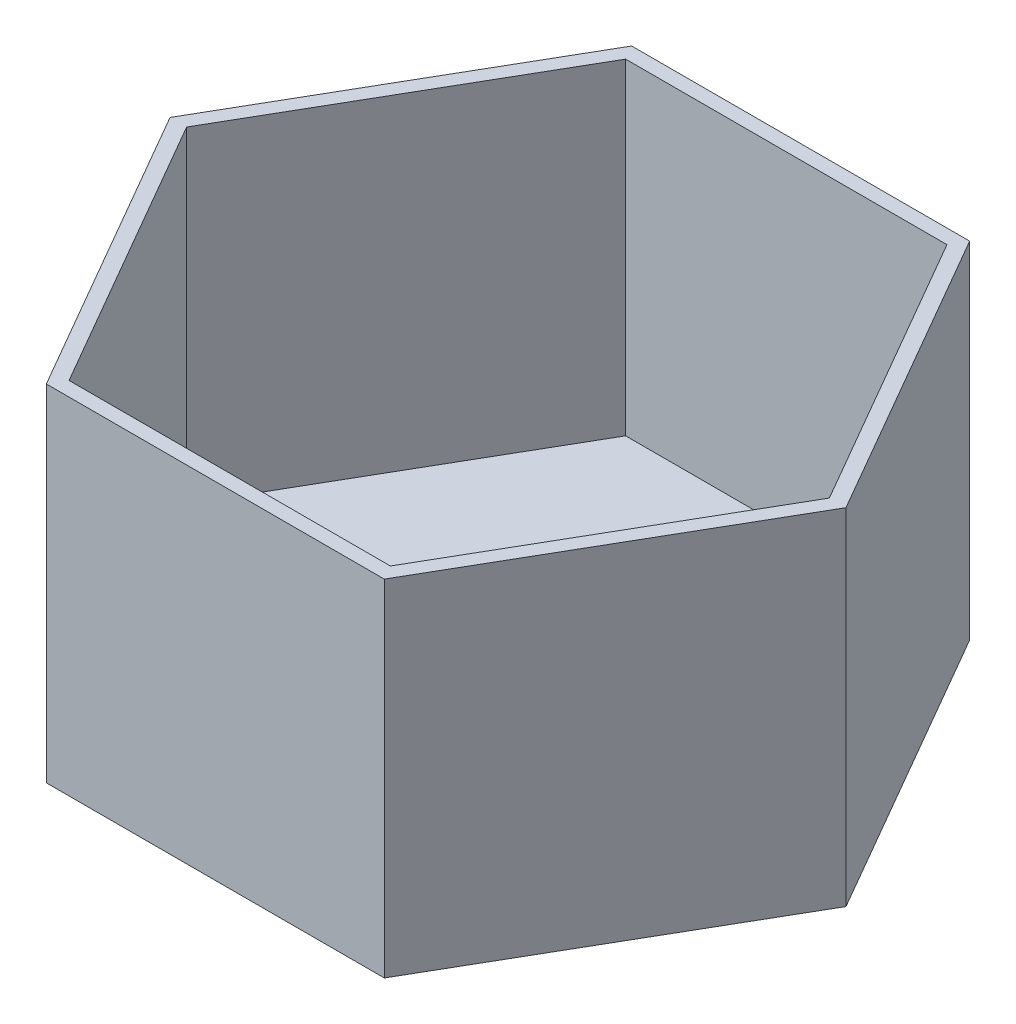
ISO-10303-21;
HEADER;
FILE_DESCRIPTION(('STEP AP214'),'2;1');
FILE_NAME('part.step','',(''),(''),'','','');
FILE_SCHEMA(('AUTOMOTIVE_DESIGN { 1 0 10303 214 1 1 1 1 }'));
ENDSEC;
DATA;
#1=APPLICATION_CONTEXT('core data for automotive mechanical design processes');
#2=APPLICATION_PROTOCOL_DEFINITION('international standard','automotive_design',2000,#1);
#3=PRODUCT_CONTEXT('',#1,'mechanical');
#4=PRODUCT('Part','Part','',(#3));
#5=PRODUCT_RELATED_PRODUCT_CATEGORY('part','',(#4));
#6=PRODUCT_DEFINITION_FORMATION('','',#4);
#7=PRODUCT_DEFINITION_CONTEXT('part definition',#1,'design');
#8=PRODUCT_DEFINITION('design','',#6,#7);
#9=PRODUCT_DEFINITION_SHAPE('','',#8);
#10=(LENGTH_UNIT() NAMED_UNIT(*) SI_UNIT(.MILLI.,.METRE.));
#11=(NAMED_UNIT(*) PLANE_ANGLE_UNIT() SI_UNIT($,.RADIAN.));
#12=(NAMED_UNIT(*) SI_UNIT($,.STERADIAN.) SOLID_ANGLE_UNIT());
#13=UNCERTAINTY_MEASURE_WITH_UNIT(LENGTH_MEASURE(1.E-05),#10,'distance_accuracy_value','');
#14=(GEOMETRIC_REPRESENTATION_CONTEXT(3) GLOBAL_UNCERTAINTY_ASSIGNED_CONTEXT((#13)) GLOBAL_UNIT_ASSIGNED_CONTEXT((#10,
#11,#12)) REPRESENTATION_CONTEXT('',''));
#15=CARTESIAN_POINT('',(0.,0.,0.));
#16=DIRECTION('',(0.,0.,1.));
#17=DIRECTION('',(1.,0.,0.));
#18=AXIS2_PLACEMENT_3D('',#15,#16,#17);
#19=CARTESIAN_POINT('',(35.2183664205679,72.,60.9999999999996));
#20=DIRECTION('',(-0.866025403784441,0.,-0.499999999999995));
#21=DIRECTION('',(-0.499999999999995,0.,0.866025403784442));
#22=AXIS2_PLACEMENT_3D('',#19,#20,#21);
#23=PLANE('',#22);
#24=DIRECTION('',(0.499999999999995,0.,-0.866025403784442));
#25=VECTOR('',#24,1.);
#26=CARTESIAN_POINT('',(35.2183664205679,0.,60.9999999999996));
#27=LINE('',#26,#25);
#28=CARTESIAN_POINT('',(35.2183664205679,0.,60.9999999999996));
#29=VERTEX_POINT('',#28);
#30=CARTESIAN_POINT('',(70.4367328411344,0.,0.));
#31=VERTEX_POINT('',#30);
#32=EDGE_CURVE('E133',#29,#31,#27,.T.);
#33=ORIENTED_EDGE('',*,*,#32,.T.);
#34=DIRECTION('',(0.,-1.,0.));
#35=VECTOR('',#34,1.);
#36=CARTESIAN_POINT('',(70.4367328411344,72.,0.));
#37=LINE('',#36,#35);
#38=CARTESIAN_POINT('',(70.4367328411344,72.,0.));
#39=VERTEX_POINT('',#38);
#40=EDGE_CURVE('E11',#39,#31,#37,.T.);
#41=ORIENTED_EDGE('',*,*,#40,.F.);
#42=DIRECTION('',(0.499999999999995,0.,-0.866025403784442));
#43=VECTOR('',#42,1.);
#44=CARTESIAN_POINT('',(35.2183664205679,72.,60.9999999999996));
#45=LINE('',#44,#43);
#46=CARTESIAN_POINT('',(35.2183664205679,72.,60.9999999999996));
#47=VERTEX_POINT('',#46);
#48=EDGE_CURVE('E145',#47,#39,#45,.T.);
#49=ORIENTED_EDGE('',*,*,#48,.F.);
#50=DIRECTION('',(0.,-1.,0.));
#51=VECTOR('',#50,1.);
#52=CARTESIAN_POINT('',(35.2183664205679,72.,60.9999999999996));
#53=LINE('',#52,#51);
#54=EDGE_CURVE('E129',#47,#29,#53,.T.);
#55=ORIENTED_EDGE('',*,*,#54,.T.);
#56=EDGE_LOOP('',(#33,#41,#49,#55));
#57=FACE_BOUND('',#56,.T.);
#58=ADVANCED_FACE('F37',(#57),#23,.F.);
#59=CARTESIAN_POINT('',(70.4367328411344,72.,0.));
#60=DIRECTION('',(-0.866025403784438,0.,0.500000000000001));
#61=DIRECTION('',(0.500000000000001,0.,0.866025403784438));
#62=AXIS2_PLACEMENT_3D('',#59,#60,#61);
#63=PLANE('',#62);
#64=DIRECTION('',(-0.500000000000001,0.,-0.866025403784438));
#65=VECTOR('',#64,1.);
#66=CARTESIAN_POINT('',(70.4367328411344,0.,0.));
#67=LINE('',#66,#65);
#68=CARTESIAN_POINT('',(35.2183664205671,0.,-61.0000000000001));
#69=VERTEX_POINT('',#68);
#70=EDGE_CURVE('E136',#31,#69,#67,.T.);
#71=ORIENTED_EDGE('',*,*,#70,.T.);
#72=DIRECTION('',(0.,-1.,0.));
#73=VECTOR('',#72,1.);
#74=CARTESIAN_POINT('',(35.2183664205671,72.,-61.0000000000001));
#75=LINE('',#74,#73);
#76=CARTESIAN_POINT('',(35.2183664205671,72.,-61.0000000000001));
#77=VERTEX_POINT('',#76);
#78=EDGE_CURVE('E44',#77,#69,#75,.T.);
#79=ORIENTED_EDGE('',*,*,#78,.F.);
#80=DIRECTION('',(-0.500000000000001,0.,-0.866025403784438));
#81=VECTOR('',#80,1.);
#82=CARTESIAN_POINT('',(70.4367328411344,72.,0.));
#83=LINE('',#82,#81);
#84=EDGE_CURVE('E95',#39,#77,#83,.T.);
#85=ORIENTED_EDGE('',*,*,#84,.F.);
#86=ORIENTED_EDGE('',*,*,#40,.T.);
#87=EDGE_LOOP('',(#71,#79,#85,#86));
#88=FACE_BOUND('',#87,.T.);
#89=ADVANCED_FACE('F285',(#88),#63,.F.);
#90=CARTESIAN_POINT('',(35.2183664205671,72.,-61.0000000000001));
#91=DIRECTION('',(0.,0.,1.));
#92=DIRECTION('',(1.,0.,0.));
#93=AXIS2_PLACEMENT_3D('',#90,#91,#92);
#94=PLANE('',#93);
#95=DIRECTION('',(-1.,0.,0.));
#96=VECTOR('',#95,1.);
#97=CARTESIAN_POINT('',(35.2183664205671,0.,-61.0000000000001));
#98=LINE('',#97,#96);
#99=CARTESIAN_POINT('',(-35.2183664205675,0.,-60.9999999999999));
#100=VERTEX_POINT('',#99);
#101=EDGE_CURVE('E139',#69,#100,#98,.T.);
#102=ORIENTED_EDGE('',*,*,#101,.T.);
#103=DIRECTION('',(0.,-1.,0.));
#104=VECTOR('',#103,1.);
#105=CARTESIAN_POINT('',(-35.2183664205675,72.,-60.9999999999999));
#106=LINE('',#105,#104);
#107=CARTESIAN_POINT('',(-35.2183664205675,72.,-60.9999999999999));
#108=VERTEX_POINT('',#107);
#109=EDGE_CURVE('E124',#108,#100,#106,.T.);
#110=ORIENTED_EDGE('',*,*,#109,.F.);
#111=DIRECTION('',(-1.,0.,0.));
#112=VECTOR('',#111,1.);
#113=CARTESIAN_POINT('',(35.2183664205671,72.,-61.0000000000001));
#114=LINE('',#113,#112);
#115=EDGE_CURVE('E112',#77,#108,#114,.T.);
#116=ORIENTED_EDGE('',*,*,#115,.F.);
#117=ORIENTED_EDGE('',*,*,#78,.T.);
#118=EDGE_LOOP('',(#102,#110,#116,#117));
#119=FACE_BOUND('',#118,.T.);
#120=ADVANCED_FACE('F151',(#119),#94,.F.);
#121=CARTESIAN_POINT('',(-35.2183664205675,72.,-60.9999999999999));
#122=DIRECTION('',(0.866025403784441,0.,0.499999999999995));
#123=DIRECTION('',(0.499999999999995,0.,-0.866025403784442));
#124=AXIS2_PLACEMENT_3D('',#121,#122,#123);
#125=PLANE('',#124);
#126=DIRECTION('',(-0.499999999999995,0.,0.866025403784442));
#127=VECTOR('',#126,1.);
#128=CARTESIAN_POINT('',(-35.2183664205675,0.,-60.9999999999999));
#129=LINE('',#128,#127);
#130=CARTESIAN_POINT('',(-70.4367328411344,0.,4.918570765678E-13));
#131=VERTEX_POINT('',#130);
#132=EDGE_CURVE('E121',#100,#131,#129,.T.);
#133=ORIENTED_EDGE('',*,*,#132,.T.);
#134=DIRECTION('',(0.,-1.,0.));
#135=VECTOR('',#134,1.);
#136=CARTESIAN_POINT('',(-70.4367328411344,72.,4.918570765678E-13));
#137=LINE('',#136,#135);
#138=CARTESIAN_POINT('',(-70.4367328411344,72.,4.918570765678E-13));
#139=VERTEX_POINT('',#138);
#140=EDGE_CURVE('E118',#139,#131,#137,.T.);
#141=ORIENTED_EDGE('',*,*,#140,.F.);
#142=DIRECTION('',(-0.499999999999995,0.,0.866025403784442));
#143=VECTOR('',#142,1.);
#144=CARTESIAN_POINT('',(-35.2183664205675,72.,-60.9999999999999));
#145=LINE('',#144,#143);
#146=EDGE_CURVE('E105',#108,#139,#145,.T.);
#147=ORIENTED_EDGE('',*,*,#146,.F.);
#148=ORIENTED_EDGE('',*,*,#109,.T.);
#149=EDGE_LOOP('',(#133,#141,#147,#148));
#150=FACE_BOUND('',#149,.T.);
#151=ADVANCED_FACE('F119',(#150),#125,.F.);
#152=CARTESIAN_POINT('',(-70.4367328411344,72.,4.918570765678E-13));
#153=DIRECTION('',(0.866025403784434,0.,-0.500000000000007));
#154=DIRECTION('',(-0.500000000000007,0.,-0.866025403784435));
#155=AXIS2_PLACEMENT_3D('',#152,#153,#154);
#156=PLANE('',#155);
#157=DIRECTION('',(0.500000000000007,0.,0.866025403784434));
#158=VECTOR('',#157,1.);
#159=CARTESIAN_POINT('',(-70.4367328411344,0.,4.918570765678E-13));
#160=LINE('',#159,#158);
#161=CARTESIAN_POINT('',(-35.2183664205666,0.,61.0000000000004));
#162=VERTEX_POINT('',#161);
#163=EDGE_CURVE('E142',#131,#162,#160,.T.);
#164=ORIENTED_EDGE('',*,*,#163,.T.);
#165=DIRECTION('',(0.,-1.,0.));
#166=VECTOR('',#165,1.);
#167=CARTESIAN_POINT('',(-35.2183664205666,72.,61.0000000000004));
#168=LINE('',#167,#166);
#169=CARTESIAN_POINT('',(-35.2183664205666,72.,61.0000000000004));
#170=VERTEX_POINT('',#169);
#171=EDGE_CURVE('E125',#170,#162,#168,.T.);
#172=ORIENTED_EDGE('',*,*,#171,.F.);
#173=DIRECTION('',(0.500000000000007,0.,0.866025403784434));
#174=VECTOR('',#173,1.);
#175=CARTESIAN_POINT('',(-70.4367328411344,72.,4.918570765678E-13));
#176=LINE('',#175,#174);
#177=EDGE_CURVE('E109',#139,#170,#176,.T.);
#178=ORIENTED_EDGE('',*,*,#177,.F.);
#179=ORIENTED_EDGE('',*,*,#140,.T.);
#180=EDGE_LOOP('',(#164,#172,#178,#179));
#181=FACE_BOUND('',#180,.T.);
#182=ADVANCED_FACE('F127',(#181),#156,.F.);
#183=CARTESIAN_POINT('',(-35.2183664205666,72.,61.0000000000004));
#184=DIRECTION('',(0.,0.,-1.));
#185=DIRECTION('',(-1.,0.,0.));
#186=AXIS2_PLACEMENT_3D('',#183,#184,#185);
#187=PLANE('',#186);
#188=DIRECTION('',(1.,0.,0.));
#189=VECTOR('',#188,1.);
#190=CARTESIAN_POINT('',(-35.2183664205666,0.,61.0000000000004));
#191=LINE('',#190,#189);
#192=EDGE_CURVE('E87',#162,#29,#191,.T.);
#193=ORIENTED_EDGE('',*,*,#192,.T.);
#194=ORIENTED_EDGE('',*,*,#54,.F.);
#195=DIRECTION('',(1.,0.,0.));
#196=VECTOR('',#195,1.);
#197=CARTESIAN_POINT('',(-35.2183664205666,72.,61.0000000000004));
#198=LINE('',#197,#196);
#199=EDGE_CURVE('E60',#170,#47,#198,.T.);
#200=ORIENTED_EDGE('',*,*,#199,.F.);
#201=ORIENTED_EDGE('',*,*,#171,.T.);
#202=EDGE_LOOP('',(#193,#194,#200,#201));
#203=FACE_BOUND('',#202,.T.);
#204=ADVANCED_FACE('F155',(#203),#187,.F.);
#205=CARTESIAN_POINT('',(0.,72.,0.));
#206=DIRECTION('',(0.,1.,0.));
#207=DIRECTION('',(0.,0.,1.));
#208=AXIS2_PLACEMENT_3D('',#205,#206,#207);
#209=PLANE('',#208);
#210=DIRECTION('',(0.499999999999999,0.,-0.866025403784439));
#211=VECTOR('',#210,1.);
#212=CARTESIAN_POINT('',(33.4863156129983,72.,58.));
#213=LINE('',#212,#211);
#214=CARTESIAN_POINT('',(33.4863156129983,72.,58.));
#215=VERTEX_POINT('',#214);
#216=CARTESIAN_POINT('',(66.9726312259966,72.,0.));
#217=VERTEX_POINT('',#216);
#218=EDGE_CURVE('E51',#215,#217,#213,.T.);
#219=ORIENTED_EDGE('',*,*,#218,.F.);
#220=DIRECTION('',(1.,0.,0.));
#221=VECTOR('',#220,1.);
#222=CARTESIAN_POINT('',(-33.4863156129983,72.,58.));
#223=LINE('',#222,#221);
#224=CARTESIAN_POINT('',(-33.4863156129983,72.,58.));
#225=VERTEX_POINT('',#224);
#226=EDGE_CURVE('E178',#225,#215,#223,.T.);
#227=ORIENTED_EDGE('',*,*,#226,.F.);
#228=DIRECTION('',(0.5,0.,0.866025403784438));
#229=VECTOR('',#228,1.);
#230=CARTESIAN_POINT('',(-66.9726312259966,72.,0.));
#231=LINE('',#230,#229);
#232=CARTESIAN_POINT('',(-66.9726312259966,72.,0.));
#233=VERTEX_POINT('',#232);
#234=EDGE_CURVE('E182',#233,#225,#231,.T.);
#235=ORIENTED_EDGE('',*,*,#234,.F.);
#236=DIRECTION('',(-0.499999999999999,0.,0.866025403784439));
#237=VECTOR('',#236,1.);
#238=CARTESIAN_POINT('',(-33.4863156129983,72.,-58.));
#239=LINE('',#238,#237);
#240=CARTESIAN_POINT('',(-33.4863156129983,72.,-58.));
#241=VERTEX_POINT('',#240);
#242=EDGE_CURVE('E185',#241,#233,#239,.T.);
#243=ORIENTED_EDGE('',*,*,#242,.F.);
#244=DIRECTION('',(-1.,0.,0.));
#245=VECTOR('',#244,1.);
#246=CARTESIAN_POINT('',(33.4863156129983,72.,-58.0000000000001));
#247=LINE('',#246,#245);
#248=CARTESIAN_POINT('',(33.4863156129983,72.,-58.0000000000001));
#249=VERTEX_POINT('',#248);
#250=EDGE_CURVE('E188',#249,#241,#247,.T.);
#251=ORIENTED_EDGE('',*,*,#250,.F.);
#252=DIRECTION('',(-0.5,0.,-0.866025403784439));
#253=VECTOR('',#252,1.);
#254=CARTESIAN_POINT('',(66.9726312259966,72.,0.));
#255=LINE('',#254,#253);
#256=EDGE_CURVE('E191',#217,#249,#255,.T.);
#257=ORIENTED_EDGE('',*,*,#256,.F.);
#258=EDGE_LOOP('',(#219,#227,#235,#243,#251,#257));
#259=FACE_BOUND('',#258,.T.);
#260=ORIENTED_EDGE('',*,*,#48,.T.);
#261=ORIENTED_EDGE('',*,*,#84,.T.);
#262=ORIENTED_EDGE('',*,*,#115,.T.);
#263=ORIENTED_EDGE('',*,*,#146,.T.);
#264=ORIENTED_EDGE('',*,*,#177,.T.);
#265=ORIENTED_EDGE('',*,*,#199,.T.);
#266=EDGE_LOOP('',(#260,#261,#262,#263,#264,#265));
#267=FACE_BOUND('',#266,.T.);
#268=ADVANCED_FACE('F107',(#259,#267),#209,.T.);
#269=CARTESIAN_POINT('',(0.,0.,0.));
#270=DIRECTION('',(0.,1.,0.));
#271=DIRECTION('',(0.,0.,1.));
#272=AXIS2_PLACEMENT_3D('',#269,#270,#271);
#273=PLANE('',#272);
#274=ORIENTED_EDGE('',*,*,#32,.F.);
#275=ORIENTED_EDGE('',*,*,#192,.F.);
#276=ORIENTED_EDGE('',*,*,#163,.F.);
#277=ORIENTED_EDGE('',*,*,#132,.F.);
#278=ORIENTED_EDGE('',*,*,#101,.F.);
#279=ORIENTED_EDGE('',*,*,#70,.F.);
#280=EDGE_LOOP('',(#274,#275,#276,#277,#278,#279));
#281=FACE_BOUND('',#280,.T.);
#282=ADVANCED_FACE('F154',(#281),#273,.F.);
#283=CARTESIAN_POINT('',(33.4863156129983,3.99999999999999,58.));
#284=DIRECTION('',(0.866025403784439,0.,0.499999999999999));
#285=DIRECTION('',(0.499999999999999,0.,-0.866025403784439));
#286=AXIS2_PLACEMENT_3D('',#283,#284,#285);
#287=PLANE('',#286);
#288=ORIENTED_EDGE('',*,*,#218,.T.);
#289=DIRECTION('',(0.,1.,0.));
#290=VECTOR('',#289,1.);
#291=CARTESIAN_POINT('',(66.9726312259966,3.99999999999999,0.));
#292=LINE('',#291,#290);
#293=CARTESIAN_POINT('',(66.9726312259966,3.99999999999999,0.));
#294=VERTEX_POINT('',#293);
#295=EDGE_CURVE('E162',#294,#217,#292,.T.);
#296=ORIENTED_EDGE('',*,*,#295,.F.);
#297=DIRECTION('',(0.499999999999999,0.,-0.866025403784439));
#298=VECTOR('',#297,1.);
#299=CARTESIAN_POINT('',(33.4863156129983,3.99999999999999,58.));
#300=LINE('',#299,#298);
#301=CARTESIAN_POINT('',(33.4863156129983,3.99999999999999,58.));
#302=VERTEX_POINT('',#301);
#303=EDGE_CURVE('E181',#302,#294,#300,.T.);
#304=ORIENTED_EDGE('',*,*,#303,.F.);
#305=DIRECTION('',(0.,1.,0.));
#306=VECTOR('',#305,1.);
#307=CARTESIAN_POINT('',(33.4863156129983,3.99999999999999,58.));
#308=LINE('',#307,#306);
#309=EDGE_CURVE('E137',#302,#215,#308,.T.);
#310=ORIENTED_EDGE('',*,*,#309,.T.);
#311=EDGE_LOOP('',(#288,#296,#304,#310));
#312=FACE_BOUND('',#311,.T.);
#313=ADVANCED_FACE('F237',(#312),#287,.F.);
#314=CARTESIAN_POINT('',(-33.4863156129983,3.99999999999999,58.));
#315=DIRECTION('',(0.,0.,1.));
#316=DIRECTION('',(1.,0.,0.));
#317=AXIS2_PLACEMENT_3D('',#314,#315,#316);
#318=PLANE('',#317);
#319=ORIENTED_EDGE('',*,*,#226,.T.);
#320=ORIENTED_EDGE('',*,*,#309,.F.);
#321=DIRECTION('',(1.,0.,0.));
#322=VECTOR('',#321,1.);
#323=CARTESIAN_POINT('',(-33.4863156129983,3.99999999999999,58.));
#324=LINE('',#323,#322);
#325=CARTESIAN_POINT('',(-33.4863156129983,3.99999999999999,58.));
#326=VERTEX_POINT('',#325);
#327=EDGE_CURVE('E165',#326,#302,#324,.T.);
#328=ORIENTED_EDGE('',*,*,#327,.F.);
#329=DIRECTION('',(0.,1.,0.));
#330=VECTOR('',#329,1.);
#331=CARTESIAN_POINT('',(-33.4863156129983,3.99999999999999,58.));
#332=LINE('',#331,#330);
#333=EDGE_CURVE('E174',#326,#225,#332,.T.);
#334=ORIENTED_EDGE('',*,*,#333,.T.);
#335=EDGE_LOOP('',(#319,#320,#328,#334));
#336=FACE_BOUND('',#335,.T.);
#337=ADVANCED_FACE('F253',(#336),#318,.F.);
#338=CARTESIAN_POINT('',(-66.9726312259966,3.99999999999999,0.));
#339=DIRECTION('',(-0.866025403784438,0.,0.5));
#340=DIRECTION('',(0.5,0.,0.866025403784438));
#341=AXIS2_PLACEMENT_3D('',#338,#339,#340);
#342=PLANE('',#341);
#343=ORIENTED_EDGE('',*,*,#234,.T.);
#344=ORIENTED_EDGE('',*,*,#333,.F.);
#345=DIRECTION('',(0.5,0.,0.866025403784438));
#346=VECTOR('',#345,1.);
#347=CARTESIAN_POINT('',(-66.9726312259966,3.99999999999999,0.));
#348=LINE('',#347,#346);
#349=CARTESIAN_POINT('',(-66.9726312259966,3.99999999999999,0.));
#350=VERTEX_POINT('',#349);
#351=EDGE_CURVE('E198',#350,#326,#348,.T.);
#352=ORIENTED_EDGE('',*,*,#351,.F.);
#353=DIRECTION('',(0.,1.,0.));
#354=VECTOR('',#353,1.);
#355=CARTESIAN_POINT('',(-66.9726312259966,3.99999999999999,0.));
#356=LINE('',#355,#354);
#357=EDGE_CURVE('E171',#350,#233,#356,.T.);
#358=ORIENTED_EDGE('',*,*,#357,.T.);
#359=EDGE_LOOP('',(#343,#344,#352,#358));
#360=FACE_BOUND('',#359,.T.);
#361=ADVANCED_FACE('F258',(#360),#342,.F.);
#362=CARTESIAN_POINT('',(-33.4863156129983,3.99999999999999,-58.));
#363=DIRECTION('',(-0.866025403784439,0.,-0.5));
#364=DIRECTION('',(-0.5,0.,0.866025403784439));
#365=AXIS2_PLACEMENT_3D('',#362,#363,#364);
#366=PLANE('',#365);
#367=ORIENTED_EDGE('',*,*,#242,.T.);
#368=ORIENTED_EDGE('',*,*,#357,.F.);
#369=DIRECTION('',(-0.499999999999999,0.,0.866025403784439));
#370=VECTOR('',#369,1.);
#371=CARTESIAN_POINT('',(-33.4863156129983,3.99999999999999,-58.));
#372=LINE('',#371,#370);
#373=CARTESIAN_POINT('',(-33.4863156129983,3.99999999999999,-58.));
#374=VERTEX_POINT('',#373);
#375=EDGE_CURVE('E201',#374,#350,#372,.T.);
#376=ORIENTED_EDGE('',*,*,#375,.F.);
#377=DIRECTION('',(0.,1.,0.));
#378=VECTOR('',#377,1.);
#379=CARTESIAN_POINT('',(-33.4863156129983,3.99999999999999,-58.));
#380=LINE('',#379,#378);
#381=EDGE_CURVE('E168',#374,#241,#380,.T.);
#382=ORIENTED_EDGE('',*,*,#381,.T.);
#383=EDGE_LOOP('',(#367,#368,#376,#382));
#384=FACE_BOUND('',#383,.T.);
#385=ADVANCED_FACE('F275',(#384),#366,.F.);
#386=CARTESIAN_POINT('',(33.4863156129983,3.99999999999999,-58.0000000000001));
#387=DIRECTION('',(0.,0.,-1.));
#388=DIRECTION('',(-1.,0.,0.));
#389=AXIS2_PLACEMENT_3D('',#386,#387,#388);
#390=PLANE('',#389);
#391=ORIENTED_EDGE('',*,*,#250,.T.);
#392=ORIENTED_EDGE('',*,*,#381,.F.);
#393=DIRECTION('',(-1.,0.,0.));
#394=VECTOR('',#393,1.);
#395=CARTESIAN_POINT('',(33.4863156129983,3.99999999999999,-58.0000000000001));
#396=LINE('',#395,#394);
#397=CARTESIAN_POINT('',(33.4863156129983,3.99999999999999,-58.0000000000001));
#398=VERTEX_POINT('',#397);
#399=EDGE_CURVE('E204',#398,#374,#396,.T.);
#400=ORIENTED_EDGE('',*,*,#399,.F.);
#401=DIRECTION('',(0.,1.,0.));
#402=VECTOR('',#401,1.);
#403=CARTESIAN_POINT('',(33.4863156129983,3.99999999999999,-58.0000000000001));
#404=LINE('',#403,#402);
#405=EDGE_CURVE('E164',#398,#249,#404,.T.);
#406=ORIENTED_EDGE('',*,*,#405,.T.);
#407=EDGE_LOOP('',(#391,#392,#400,#406));
#408=FACE_BOUND('',#407,.T.);
#409=ADVANCED_FACE('F271',(#408),#390,.F.);
#410=CARTESIAN_POINT('',(66.9726312259966,3.99999999999999,0.));
#411=DIRECTION('',(0.866025403784439,0.,-0.5));
#412=DIRECTION('',(-0.5,0.,-0.866025403784439));
#413=AXIS2_PLACEMENT_3D('',#410,#411,#412);
#414=PLANE('',#413);
#415=ORIENTED_EDGE('',*,*,#256,.T.);
#416=ORIENTED_EDGE('',*,*,#405,.F.);
#417=DIRECTION('',(-0.5,0.,-0.866025403784439));
#418=VECTOR('',#417,1.);
#419=CARTESIAN_POINT('',(66.9726312259966,3.99999999999999,0.));
#420=LINE('',#419,#418);
#421=EDGE_CURVE('E207',#294,#398,#420,.T.);
#422=ORIENTED_EDGE('',*,*,#421,.F.);
#423=ORIENTED_EDGE('',*,*,#295,.T.);
#424=EDGE_LOOP('',(#415,#416,#422,#423));
#425=FACE_BOUND('',#424,.T.);
#426=ADVANCED_FACE('F229',(#425),#414,.F.);
#427=CARTESIAN_POINT('',(0.,3.99999999999999,0.));
#428=DIRECTION('',(0.,1.,0.));
#429=DIRECTION('',(0.,0.,1.));
#430=AXIS2_PLACEMENT_3D('',#427,#428,#429);
#431=PLANE('',#430);
#432=CARTESIAN_POINT('',(0.,3.99999999999999,0.));
#433=DIRECTION('',(0.,1.,0.));
#434=DIRECTION('',(0.,0.,1.));
#435=AXIS2_PLACEMENT_3D('',#432,#433,#434);
#436=CIRCLE('',#435,27.5);
#437=CARTESIAN_POINT('',(0.,3.99999999999999,27.5));
#438=VERTEX_POINT('',#437);
#439=EDGE_CURVE('E212',#438,#438,#436,.T.);
#440=ORIENTED_EDGE('',*,*,#439,.F.);
#441=EDGE_LOOP('',(#440));
#442=FACE_BOUND('',#441,.T.);
#443=ORIENTED_EDGE('',*,*,#303,.T.);
#444=ORIENTED_EDGE('',*,*,#421,.T.);
#445=ORIENTED_EDGE('',*,*,#399,.T.);
#446=ORIENTED_EDGE('',*,*,#375,.T.);
#447=ORIENTED_EDGE('',*,*,#351,.T.);
#448=ORIENTED_EDGE('',*,*,#327,.T.);
#449=EDGE_LOOP('',(#443,#444,#445,#446,#447,#448));
#450=FACE_BOUND('',#449,.T.);
#451=ADVANCED_FACE('F223',(#442,#450),#431,.T.);
#452=CARTESIAN_POINT('',(0.,8.99999999999999,0.));
#453=DIRECTION('',(0.,-1.,0.));
#454=DIRECTION('',(0.,0.,-1.));
#455=AXIS2_PLACEMENT_3D('',#452,#453,#454);
#456=CYLINDRICAL_SURFACE('',#455,27.5);
#457=CARTESIAN_POINT('',(0.,8.99999999999999,0.));
#458=DIRECTION('',(0.,1.,0.));
#459=DIRECTION('',(0.,0.,1.));
#460=AXIS2_PLACEMENT_3D('',#457,#458,#459);
#461=CIRCLE('',#460,27.5);
#462=CARTESIAN_POINT('',(0.,8.99999999999999,27.5));
#463=VERTEX_POINT('',#462);
#464=EDGE_CURVE('E195',#463,#463,#461,.T.);
#465=ORIENTED_EDGE('',*,*,#464,.F.);
#466=EDGE_LOOP('',(#465));
#467=FACE_BOUND('',#466,.T.);
#468=ORIENTED_EDGE('',*,*,#439,.T.);
#469=EDGE_LOOP('',(#468));
#470=FACE_BOUND('',#469,.T.);
#471=ADVANCED_FACE('F220',(#467,#470),#456,.T.);
#472=CARTESIAN_POINT('',(0.,8.99999999999999,0.));
#473=DIRECTION('',(0.,1.,0.));
#474=DIRECTION('',(0.,0.,1.));
#475=AXIS2_PLACEMENT_3D('',#472,#473,#474);
#476=PLANE('',#475);
#477=ORIENTED_EDGE('',*,*,#464,.T.);
#478=EDGE_LOOP('',(#477));
#479=FACE_BOUND('',#478,.T.);
#480=ADVANCED_FACE('F218',(#479),#476,.T.);
#481=CLOSED_SHELL('',(#58,#89,#120,#151,#182,#204,#268,#282,#313,#337,#361,#385,#409,#426,#451,
#471,#480));
#482=MANIFOLD_SOLID_BREP('B2',#481);
#483=ADVANCED_BREP_SHAPE_REPRESENTATION('',(#18,#482),#14);
#484=SHAPE_DEFINITION_REPRESENTATION(#9,#483);
ENDSEC;
END-ISO-10303-21;
